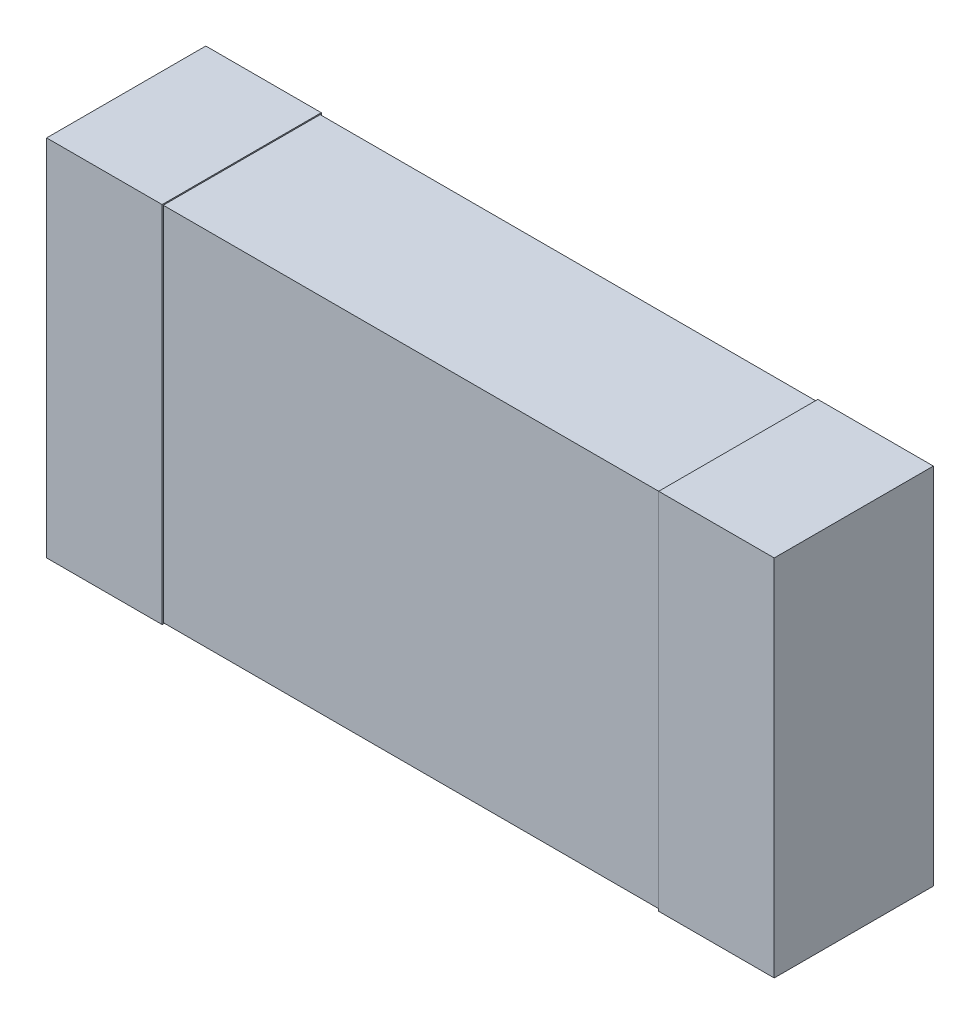
ISO-10303-21;
HEADER;
FILE_DESCRIPTION(('STEP AP214'),'2;1');
FILE_NAME('part.step','',(''),(''),'','','');
FILE_SCHEMA(('AUTOMOTIVE_DESIGN { 1 0 10303 214 1 1 1 1 }'));
ENDSEC;
DATA;
#1=APPLICATION_CONTEXT('core data for automotive mechanical design processes');
#2=APPLICATION_PROTOCOL_DEFINITION('international standard','automotive_design',2000,#1);
#3=PRODUCT_CONTEXT('',#1,'mechanical');
#4=PRODUCT('Part','Part','',(#3));
#5=PRODUCT_RELATED_PRODUCT_CATEGORY('part','',(#4));
#6=PRODUCT_DEFINITION_FORMATION('','',#4);
#7=PRODUCT_DEFINITION_CONTEXT('part definition',#1,'design');
#8=PRODUCT_DEFINITION('design','',#6,#7);
#9=PRODUCT_DEFINITION_SHAPE('','',#8);
#10=(LENGTH_UNIT() NAMED_UNIT(*) SI_UNIT(.MILLI.,.METRE.));
#11=(NAMED_UNIT(*) PLANE_ANGLE_UNIT() SI_UNIT($,.RADIAN.));
#12=(NAMED_UNIT(*) SI_UNIT($,.STERADIAN.) SOLID_ANGLE_UNIT());
#13=UNCERTAINTY_MEASURE_WITH_UNIT(LENGTH_MEASURE(1.E-05),#10,'distance_accuracy_value','');
#14=(GEOMETRIC_REPRESENTATION_CONTEXT(3) GLOBAL_UNCERTAINTY_ASSIGNED_CONTEXT((#13)) GLOBAL_UNIT_ASSIGNED_CONTEXT((#10,
#11,#12)) REPRESENTATION_CONTEXT('',''));
#15=CARTESIAN_POINT('',(0.,0.,0.));
#16=DIRECTION('',(0.,0.,1.));
#17=DIRECTION('',(1.,0.,0.));
#18=AXIS2_PLACEMENT_3D('',#15,#16,#17);
#19=CARTESIAN_POINT('',(1.6,-0.8,0.0762));
#20=DIRECTION('',(1.,0.,0.));
#21=DIRECTION('',(0.,0.,-1.));
#22=AXIS2_PLACEMENT_3D('',#19,#20,#21);
#23=PLANE('',#22);
#24=DIRECTION('',(0.,0.,-1.));
#25=VECTOR('',#24,1.);
#26=CARTESIAN_POINT('',(1.6,-0.8,0.0762));
#27=LINE('',#26,#25);
#28=CARTESIAN_POINT('',(1.6,-0.8,0.7762));
#29=VERTEX_POINT('',#28);
#30=CARTESIAN_POINT('',(1.6,-0.8,0.0762));
#31=VERTEX_POINT('',#30);
#32=EDGE_CURVE('E20',#29,#31,#27,.T.);
#33=ORIENTED_EDGE('',*,*,#32,.T.);
#34=DIRECTION('',(0.,1.,0.));
#35=VECTOR('',#34,1.);
#36=CARTESIAN_POINT('',(1.6,0.,0.0762));
#37=LINE('',#36,#35);
#38=CARTESIAN_POINT('',(1.6,0.8,0.0762));
#39=VERTEX_POINT('',#38);
#40=EDGE_CURVE('E116',#31,#39,#37,.T.);
#41=ORIENTED_EDGE('',*,*,#40,.T.);
#42=DIRECTION('',(0.,0.,1.));
#43=VECTOR('',#42,1.);
#44=CARTESIAN_POINT('',(1.6,0.8,0.0762));
#45=LINE('',#44,#43);
#46=CARTESIAN_POINT('',(1.6,0.8,0.7762));
#47=VERTEX_POINT('',#46);
#48=EDGE_CURVE('E107',#47,#39,#45,.F.);
#49=ORIENTED_EDGE('',*,*,#48,.F.);
#50=DIRECTION('',(0.,1.,0.));
#51=VECTOR('',#50,1.);
#52=CARTESIAN_POINT('',(1.6,0.,0.7762));
#53=LINE('',#52,#51);
#54=EDGE_CURVE('E102',#29,#47,#53,.T.);
#55=ORIENTED_EDGE('',*,*,#54,.F.);
#56=EDGE_LOOP('',(#33,#41,#49,#55));
#57=FACE_BOUND('',#56,.T.);
#58=ADVANCED_FACE('F17',(#57),#23,.T.);
#59=CARTESIAN_POINT('',(-1.6,0.8,0.0762));
#60=DIRECTION('',(-1.,0.,0.));
#61=DIRECTION('',(0.,0.,1.));
#62=AXIS2_PLACEMENT_3D('',#59,#60,#61);
#63=PLANE('',#62);
#64=DIRECTION('',(0.,0.,1.));
#65=VECTOR('',#64,1.);
#66=CARTESIAN_POINT('',(-1.6,0.8,0.0762));
#67=LINE('',#66,#65);
#68=CARTESIAN_POINT('',(-1.6,0.8,0.7762));
#69=VERTEX_POINT('',#68);
#70=CARTESIAN_POINT('',(-1.6,0.8,0.0762));
#71=VERTEX_POINT('',#70);
#72=EDGE_CURVE('E122',#69,#71,#67,.F.);
#73=ORIENTED_EDGE('',*,*,#72,.T.);
#74=DIRECTION('',(0.,1.,0.));
#75=VECTOR('',#74,1.);
#76=CARTESIAN_POINT('',(-1.6,0.,0.0762));
#77=LINE('',#76,#75);
#78=CARTESIAN_POINT('',(-1.6,-0.8,0.0762));
#79=VERTEX_POINT('',#78);
#80=EDGE_CURVE('E136',#71,#79,#77,.F.);
#81=ORIENTED_EDGE('',*,*,#80,.T.);
#82=DIRECTION('',(0.,0.,-1.));
#83=VECTOR('',#82,1.);
#84=CARTESIAN_POINT('',(-1.6,-0.8,0.0762));
#85=LINE('',#84,#83);
#86=CARTESIAN_POINT('',(-1.6,-0.8,0.7762));
#87=VERTEX_POINT('',#86);
#88=EDGE_CURVE('E149',#87,#79,#85,.T.);
#89=ORIENTED_EDGE('',*,*,#88,.F.);
#90=DIRECTION('',(0.,1.,0.));
#91=VECTOR('',#90,1.);
#92=CARTESIAN_POINT('',(-1.6,0.,0.7762));
#93=LINE('',#92,#91);
#94=EDGE_CURVE('E138',#69,#87,#93,.F.);
#95=ORIENTED_EDGE('',*,*,#94,.F.);
#96=EDGE_LOOP('',(#73,#81,#89,#95));
#97=FACE_BOUND('',#96,.T.);
#98=ADVANCED_FACE('F134',(#97),#63,.T.);
#99=CARTESIAN_POINT('',(0.,0.,0.0762));
#100=DIRECTION('',(0.,0.,1.));
#101=DIRECTION('',(1.,0.,0.));
#102=AXIS2_PLACEMENT_3D('',#99,#100,#101);
#103=PLANE('',#102);
#104=ORIENTED_EDGE('',*,*,#40,.F.);
#105=DIRECTION('',(1.,0.,0.));
#106=VECTOR('',#105,1.);
#107=CARTESIAN_POINT('',(-1.6,-0.8,0.0762));
#108=LINE('',#107,#106);
#109=CARTESIAN_POINT('',(1.092,-0.8,0.0762));
#110=VERTEX_POINT('',#109);
#111=EDGE_CURVE('E169',#110,#31,#108,.T.);
#112=ORIENTED_EDGE('',*,*,#111,.F.);
#113=DIRECTION('',(0.,1.,0.));
#114=VECTOR('',#113,1.);
#115=CARTESIAN_POINT('',(1.092,-0.8,0.0762));
#116=LINE('',#115,#114);
#117=CARTESIAN_POINT('',(1.092,0.8,0.0762));
#118=VERTEX_POINT('',#117);
#119=EDGE_CURVE('E126',#110,#118,#116,.T.);
#120=ORIENTED_EDGE('',*,*,#119,.T.);
#121=DIRECTION('',(1.,0.,0.));
#122=VECTOR('',#121,1.);
#123=CARTESIAN_POINT('',(1.6,0.8,0.0762));
#124=LINE('',#123,#122);
#125=EDGE_CURVE('E112',#39,#118,#124,.F.);
#126=ORIENTED_EDGE('',*,*,#125,.F.);
#127=EDGE_LOOP('',(#104,#112,#120,#126));
#128=FACE_BOUND('',#127,.T.);
#129=ADVANCED_FACE('F125',(#128),#103,.F.);
#130=CARTESIAN_POINT('',(1.6,0.8,0.0762));
#131=DIRECTION('',(0.,1.,0.));
#132=DIRECTION('',(0.,0.,1.));
#133=AXIS2_PLACEMENT_3D('',#130,#131,#132);
#134=PLANE('',#133);
#135=ORIENTED_EDGE('',*,*,#125,.T.);
#136=DIRECTION('',(0.,0.,-1.));
#137=VECTOR('',#136,1.);
#138=CARTESIAN_POINT('',(1.092,0.8,0.0812));
#139=LINE('',#138,#137);
#140=CARTESIAN_POINT('',(1.092,0.8,0.7762));
#141=VERTEX_POINT('',#140);
#142=EDGE_CURVE('E177',#118,#141,#139,.F.);
#143=ORIENTED_EDGE('',*,*,#142,.T.);
#144=DIRECTION('',(1.,0.,0.));
#145=VECTOR('',#144,1.);
#146=CARTESIAN_POINT('',(0.,0.8,0.7762));
#147=LINE('',#146,#145);
#148=EDGE_CURVE('E114',#47,#141,#147,.F.);
#149=ORIENTED_EDGE('',*,*,#148,.F.);
#150=ORIENTED_EDGE('',*,*,#48,.T.);
#151=EDGE_LOOP('',(#135,#143,#149,#150));
#152=FACE_BOUND('',#151,.T.);
#153=ADVANCED_FACE('F109',(#152),#134,.T.);
#154=CARTESIAN_POINT('',(0.,0.,0.7762));
#155=DIRECTION('',(0.,0.,1.));
#156=DIRECTION('',(1.,0.,0.));
#157=AXIS2_PLACEMENT_3D('',#154,#155,#156);
#158=PLANE('',#157);
#159=ORIENTED_EDGE('',*,*,#148,.T.);
#160=DIRECTION('',(0.,1.,0.));
#161=VECTOR('',#160,1.);
#162=CARTESIAN_POINT('',(1.092,-0.8,0.7762));
#163=LINE('',#162,#161);
#164=CARTESIAN_POINT('',(1.092,-0.8,0.7762));
#165=VERTEX_POINT('',#164);
#166=EDGE_CURVE('E173',#141,#165,#163,.F.);
#167=ORIENTED_EDGE('',*,*,#166,.T.);
#168=DIRECTION('',(1.,0.,0.));
#169=VECTOR('',#168,1.);
#170=CARTESIAN_POINT('',(-1.6,-0.8,0.7762));
#171=LINE('',#170,#169);
#172=EDGE_CURVE('E167',#29,#165,#171,.F.);
#173=ORIENTED_EDGE('',*,*,#172,.F.);
#174=ORIENTED_EDGE('',*,*,#54,.T.);
#175=EDGE_LOOP('',(#159,#167,#173,#174));
#176=FACE_BOUND('',#175,.T.);
#177=ADVANCED_FACE('F172',(#176),#158,.T.);
#178=CARTESIAN_POINT('',(-1.6,-0.8,0.0762));
#179=DIRECTION('',(0.,-1.,0.));
#180=DIRECTION('',(0.,0.,-1.));
#181=AXIS2_PLACEMENT_3D('',#178,#179,#180);
#182=PLANE('',#181);
#183=ORIENTED_EDGE('',*,*,#172,.T.);
#184=DIRECTION('',(0.,0.,-1.));
#185=VECTOR('',#184,1.);
#186=CARTESIAN_POINT('',(1.092,-0.8,0.0812));
#187=LINE('',#186,#185);
#188=EDGE_CURVE('E179',#165,#110,#187,.T.);
#189=ORIENTED_EDGE('',*,*,#188,.T.);
#190=ORIENTED_EDGE('',*,*,#111,.T.);
#191=ORIENTED_EDGE('',*,*,#32,.F.);
#192=EDGE_LOOP('',(#183,#189,#190,#191));
#193=FACE_BOUND('',#192,.T.);
#194=ADVANCED_FACE('F210',(#193),#182,.T.);
#195=CARTESIAN_POINT('',(-1.092,-0.8,0.0812));
#196=DIRECTION('',(0.,0.,1.));
#197=DIRECTION('',(1.,0.,0.));
#198=AXIS2_PLACEMENT_3D('',#195,#196,#197);
#199=PLANE('',#198);
#200=DIRECTION('',(1.,0.,0.));
#201=VECTOR('',#200,1.);
#202=CARTESIAN_POINT('',(-1.092,0.795,0.0812));
#203=LINE('',#202,#201);
#204=CARTESIAN_POINT('',(-1.092,0.795,0.0812));
#205=VERTEX_POINT('',#204);
#206=CARTESIAN_POINT('',(1.092,0.795,0.0812));
#207=VERTEX_POINT('',#206);
#208=EDGE_CURVE('E158',#205,#207,#203,.T.);
#209=ORIENTED_EDGE('',*,*,#208,.T.);
#210=DIRECTION('',(0.,1.,0.));
#211=VECTOR('',#210,1.);
#212=CARTESIAN_POINT('',(1.092,-0.8,0.0812));
#213=LINE('',#212,#211);
#214=CARTESIAN_POINT('',(1.092,-0.795,0.0812));
#215=VERTEX_POINT('',#214);
#216=EDGE_CURVE('E190',#207,#215,#213,.F.);
#217=ORIENTED_EDGE('',*,*,#216,.T.);
#218=DIRECTION('',(1.,0.,0.));
#219=VECTOR('',#218,1.);
#220=CARTESIAN_POINT('',(-1.092,-0.795,0.0812));
#221=LINE('',#220,#219);
#222=CARTESIAN_POINT('',(-1.092,-0.795,0.0812));
#223=VERTEX_POINT('',#222);
#224=EDGE_CURVE('E205',#215,#223,#221,.F.);
#225=ORIENTED_EDGE('',*,*,#224,.T.);
#226=DIRECTION('',(0.,1.,0.));
#227=VECTOR('',#226,1.);
#228=CARTESIAN_POINT('',(-1.092,-0.8,0.0812));
#229=LINE('',#228,#227);
#230=EDGE_CURVE('E150',#205,#223,#229,.F.);
#231=ORIENTED_EDGE('',*,*,#230,.F.);
#232=EDGE_LOOP('',(#209,#217,#225,#231));
#233=FACE_BOUND('',#232,.T.);
#234=ADVANCED_FACE('F188',(#233),#199,.F.);
#235=CARTESIAN_POINT('',(0.,0.,0.0762));
#236=DIRECTION('',(0.,0.,1.));
#237=DIRECTION('',(1.,0.,0.));
#238=AXIS2_PLACEMENT_3D('',#235,#236,#237);
#239=PLANE('',#238);
#240=ORIENTED_EDGE('',*,*,#80,.F.);
#241=DIRECTION('',(1.,0.,0.));
#242=VECTOR('',#241,1.);
#243=CARTESIAN_POINT('',(1.6,0.8,0.0762));
#244=LINE('',#243,#242);
#245=CARTESIAN_POINT('',(-1.092,0.8,0.0762));
#246=VERTEX_POINT('',#245);
#247=EDGE_CURVE('E146',#246,#71,#244,.F.);
#248=ORIENTED_EDGE('',*,*,#247,.F.);
#249=DIRECTION('',(0.,1.,0.));
#250=VECTOR('',#249,1.);
#251=CARTESIAN_POINT('',(-1.092,-0.8,0.0762));
#252=LINE('',#251,#250);
#253=CARTESIAN_POINT('',(-1.092,-0.8,0.0762));
#254=VERTEX_POINT('',#253);
#255=EDGE_CURVE('E396',#246,#254,#252,.F.);
#256=ORIENTED_EDGE('',*,*,#255,.T.);
#257=DIRECTION('',(1.,0.,0.));
#258=VECTOR('',#257,1.);
#259=CARTESIAN_POINT('',(-1.6,-0.8,0.0762));
#260=LINE('',#259,#258);
#261=EDGE_CURVE('E148',#79,#254,#260,.T.);
#262=ORIENTED_EDGE('',*,*,#261,.F.);
#263=EDGE_LOOP('',(#240,#248,#256,#262));
#264=FACE_BOUND('',#263,.T.);
#265=ADVANCED_FACE('F144',(#264),#239,.F.);
#266=CARTESIAN_POINT('',(-1.6,-0.8,0.0762));
#267=DIRECTION('',(0.,-1.,0.));
#268=DIRECTION('',(0.,0.,-1.));
#269=AXIS2_PLACEMENT_3D('',#266,#267,#268);
#270=PLANE('',#269);
#271=ORIENTED_EDGE('',*,*,#261,.T.);
#272=DIRECTION('',(0.,0.,1.));
#273=VECTOR('',#272,1.);
#274=CARTESIAN_POINT('',(-1.092,-0.8,0.0762));
#275=LINE('',#274,#273);
#276=CARTESIAN_POINT('',(-1.092,-0.8,0.7762));
#277=VERTEX_POINT('',#276);
#278=EDGE_CURVE('E393',#254,#277,#275,.T.);
#279=ORIENTED_EDGE('',*,*,#278,.T.);
#280=DIRECTION('',(1.,0.,0.));
#281=VECTOR('',#280,1.);
#282=CARTESIAN_POINT('',(0.,-0.8,0.7762));
#283=LINE('',#282,#281);
#284=EDGE_CURVE('E156',#87,#277,#283,.T.);
#285=ORIENTED_EDGE('',*,*,#284,.F.);
#286=ORIENTED_EDGE('',*,*,#88,.T.);
#287=EDGE_LOOP('',(#271,#279,#285,#286));
#288=FACE_BOUND('',#287,.T.);
#289=ADVANCED_FACE('F244',(#288),#270,.T.);
#290=CARTESIAN_POINT('',(0.,0.,0.7762));
#291=DIRECTION('',(0.,0.,1.));
#292=DIRECTION('',(1.,0.,0.));
#293=AXIS2_PLACEMENT_3D('',#290,#291,#292);
#294=PLANE('',#293);
#295=ORIENTED_EDGE('',*,*,#284,.T.);
#296=DIRECTION('',(0.,1.,0.));
#297=VECTOR('',#296,1.);
#298=CARTESIAN_POINT('',(-1.092,-0.8,0.7762));
#299=LINE('',#298,#297);
#300=CARTESIAN_POINT('',(-1.092,0.8,0.7762));
#301=VERTEX_POINT('',#300);
#302=EDGE_CURVE('E398',#277,#301,#299,.T.);
#303=ORIENTED_EDGE('',*,*,#302,.T.);
#304=DIRECTION('',(1.,0.,0.));
#305=VECTOR('',#304,1.);
#306=CARTESIAN_POINT('',(1.6,0.8,0.7762));
#307=LINE('',#306,#305);
#308=EDGE_CURVE('E155',#69,#301,#307,.T.);
#309=ORIENTED_EDGE('',*,*,#308,.F.);
#310=ORIENTED_EDGE('',*,*,#94,.T.);
#311=EDGE_LOOP('',(#295,#303,#309,#310));
#312=FACE_BOUND('',#311,.T.);
#313=ADVANCED_FACE('F241',(#312),#294,.T.);
#314=CARTESIAN_POINT('',(1.6,0.8,0.0762));
#315=DIRECTION('',(0.,1.,0.));
#316=DIRECTION('',(0.,0.,1.));
#317=AXIS2_PLACEMENT_3D('',#314,#315,#316);
#318=PLANE('',#317);
#319=ORIENTED_EDGE('',*,*,#308,.T.);
#320=DIRECTION('',(0.,0.,1.));
#321=VECTOR('',#320,1.);
#322=CARTESIAN_POINT('',(-1.092,0.8,0.0762));
#323=LINE('',#322,#321);
#324=EDGE_CURVE('E154',#301,#246,#323,.F.);
#325=ORIENTED_EDGE('',*,*,#324,.T.);
#326=ORIENTED_EDGE('',*,*,#247,.T.);
#327=ORIENTED_EDGE('',*,*,#72,.F.);
#328=EDGE_LOOP('',(#319,#325,#326,#327));
#329=FACE_BOUND('',#328,.T.);
#330=ADVANCED_FACE('F152',(#329),#318,.T.);
#331=CARTESIAN_POINT('',(-1.092,0.795,0.0762));
#332=DIRECTION('',(0.,-1.,0.));
#333=DIRECTION('',(0.,0.,-1.));
#334=AXIS2_PLACEMENT_3D('',#331,#332,#333);
#335=PLANE('',#334);
#336=DIRECTION('',(-1.,0.,0.));
#337=VECTOR('',#336,1.);
#338=CARTESIAN_POINT('',(-1.092,0.795,0.7712));
#339=LINE('',#338,#337);
#340=CARTESIAN_POINT('',(-1.092,0.795,0.7712));
#341=VERTEX_POINT('',#340);
#342=CARTESIAN_POINT('',(1.092,0.795,0.7712));
#343=VERTEX_POINT('',#342);
#344=EDGE_CURVE('E198',#341,#343,#339,.F.);
#345=ORIENTED_EDGE('',*,*,#344,.T.);
#346=DIRECTION('',(0.,0.,-1.));
#347=VECTOR('',#346,1.);
#348=CARTESIAN_POINT('',(1.092,0.795,0.0812));
#349=LINE('',#348,#347);
#350=EDGE_CURVE('E196',#343,#207,#349,.T.);
#351=ORIENTED_EDGE('',*,*,#350,.T.);
#352=ORIENTED_EDGE('',*,*,#208,.F.);
#353=DIRECTION('',(0.,0.,1.));
#354=VECTOR('',#353,1.);
#355=CARTESIAN_POINT('',(-1.092,0.795,0.0762));
#356=LINE('',#355,#354);
#357=EDGE_CURVE('E405',#205,#341,#356,.T.);
#358=ORIENTED_EDGE('',*,*,#357,.T.);
#359=EDGE_LOOP('',(#345,#351,#352,#358));
#360=FACE_BOUND('',#359,.T.);
#361=ADVANCED_FACE('F197',(#360),#335,.F.);
#362=CARTESIAN_POINT('',(1.092,-0.8,0.0812));
#363=DIRECTION('',(1.,0.,0.));
#364=DIRECTION('',(0.,0.,-1.));
#365=AXIS2_PLACEMENT_3D('',#362,#363,#364);
#366=PLANE('',#365);
#367=DIRECTION('',(0.,1.,0.));
#368=VECTOR('',#367,1.);
#369=CARTESIAN_POINT('',(1.092,0.8,0.7712));
#370=LINE('',#369,#368);
#371=CARTESIAN_POINT('',(1.092,-0.795,0.7712));
#372=VERTEX_POINT('',#371);
#373=EDGE_CURVE('E408',#343,#372,#370,.F.);
#374=ORIENTED_EDGE('',*,*,#373,.T.);
#375=DIRECTION('',(0.,0.,1.));
#376=VECTOR('',#375,1.);
#377=CARTESIAN_POINT('',(1.092,-0.795,0.7762));
#378=LINE('',#377,#376);
#379=EDGE_CURVE('E202',#372,#215,#378,.F.);
#380=ORIENTED_EDGE('',*,*,#379,.T.);
#381=ORIENTED_EDGE('',*,*,#216,.F.);
#382=ORIENTED_EDGE('',*,*,#350,.F.);
#383=EDGE_LOOP('',(#374,#380,#381,#382));
#384=FACE_BOUND('',#383,.T.);
#385=ORIENTED_EDGE('',*,*,#166,.F.);
#386=ORIENTED_EDGE('',*,*,#142,.F.);
#387=ORIENTED_EDGE('',*,*,#119,.F.);
#388=ORIENTED_EDGE('',*,*,#188,.F.);
#389=EDGE_LOOP('',(#385,#386,#387,#388));
#390=FACE_BOUND('',#389,.T.);
#391=ADVANCED_FACE('F176',(#384,#390),#366,.F.);
#392=CARTESIAN_POINT('',(-1.092,-0.795,0.7762));
#393=DIRECTION('',(0.,1.,0.));
#394=DIRECTION('',(0.,0.,1.));
#395=AXIS2_PLACEMENT_3D('',#392,#393,#394);
#396=PLANE('',#395);
#397=ORIENTED_EDGE('',*,*,#224,.F.);
#398=ORIENTED_EDGE('',*,*,#379,.F.);
#399=DIRECTION('',(-1.,0.,0.));
#400=VECTOR('',#399,1.);
#401=CARTESIAN_POINT('',(-1.092,-0.795,0.7712));
#402=LINE('',#401,#400);
#403=CARTESIAN_POINT('',(-1.092,-0.795,0.7712));
#404=VERTEX_POINT('',#403);
#405=EDGE_CURVE('E26',#372,#404,#402,.T.);
#406=ORIENTED_EDGE('',*,*,#405,.T.);
#407=DIRECTION('',(0.,0.,1.));
#408=VECTOR('',#407,1.);
#409=CARTESIAN_POINT('',(-1.092,-0.795,0.0762));
#410=LINE('',#409,#408);
#411=EDGE_CURVE('E34',#404,#223,#410,.F.);
#412=ORIENTED_EDGE('',*,*,#411,.T.);
#413=EDGE_LOOP('',(#397,#398,#406,#412));
#414=FACE_BOUND('',#413,.T.);
#415=ADVANCED_FACE('F228',(#414),#396,.F.);
#416=CARTESIAN_POINT('',(-1.092,-0.8,0.0762));
#417=DIRECTION('',(-1.,0.,0.));
#418=DIRECTION('',(0.,0.,1.));
#419=AXIS2_PLACEMENT_3D('',#416,#417,#418);
#420=PLANE('',#419);
#421=ORIENTED_EDGE('',*,*,#357,.F.);
#422=ORIENTED_EDGE('',*,*,#230,.T.);
#423=ORIENTED_EDGE('',*,*,#411,.F.);
#424=DIRECTION('',(0.,1.,0.));
#425=VECTOR('',#424,1.);
#426=CARTESIAN_POINT('',(-1.092,0.8,0.7712));
#427=LINE('',#426,#425);
#428=EDGE_CURVE('E11',#404,#341,#427,.T.);
#429=ORIENTED_EDGE('',*,*,#428,.T.);
#430=EDGE_LOOP('',(#421,#422,#423,#429));
#431=FACE_BOUND('',#430,.T.);
#432=ORIENTED_EDGE('',*,*,#302,.F.);
#433=ORIENTED_EDGE('',*,*,#278,.F.);
#434=ORIENTED_EDGE('',*,*,#255,.F.);
#435=ORIENTED_EDGE('',*,*,#324,.F.);
#436=EDGE_LOOP('',(#432,#433,#434,#435));
#437=FACE_BOUND('',#436,.T.);
#438=ADVANCED_FACE('F222',(#431,#437),#420,.F.);
#439=CARTESIAN_POINT('',(-1.092,0.8,0.7712));
#440=DIRECTION('',(0.,0.,-1.));
#441=DIRECTION('',(-1.,0.,0.));
#442=AXIS2_PLACEMENT_3D('',#439,#440,#441);
#443=PLANE('',#442);
#444=ORIENTED_EDGE('',*,*,#405,.F.);
#445=ORIENTED_EDGE('',*,*,#373,.F.);
#446=ORIENTED_EDGE('',*,*,#344,.F.);
#447=ORIENTED_EDGE('',*,*,#428,.F.);
#448=EDGE_LOOP('',(#444,#445,#446,#447));
#449=FACE_BOUND('',#448,.T.);
#450=ADVANCED_FACE('F220',(#449),#443,.F.);
#451=CLOSED_SHELL('',(#58,#98,#129,#153,#177,#194,#234,#265,#289,#313,#330,#361,#391,#415,#438,#450));
#452=MANIFOLD_SOLID_BREP('B1',#451);
#453=ADVANCED_BREP_SHAPE_REPRESENTATION('',(#18,#452),#14);
#454=SHAPE_DEFINITION_REPRESENTATION(#9,#453);
ENDSEC;
END-ISO-10303-21;
